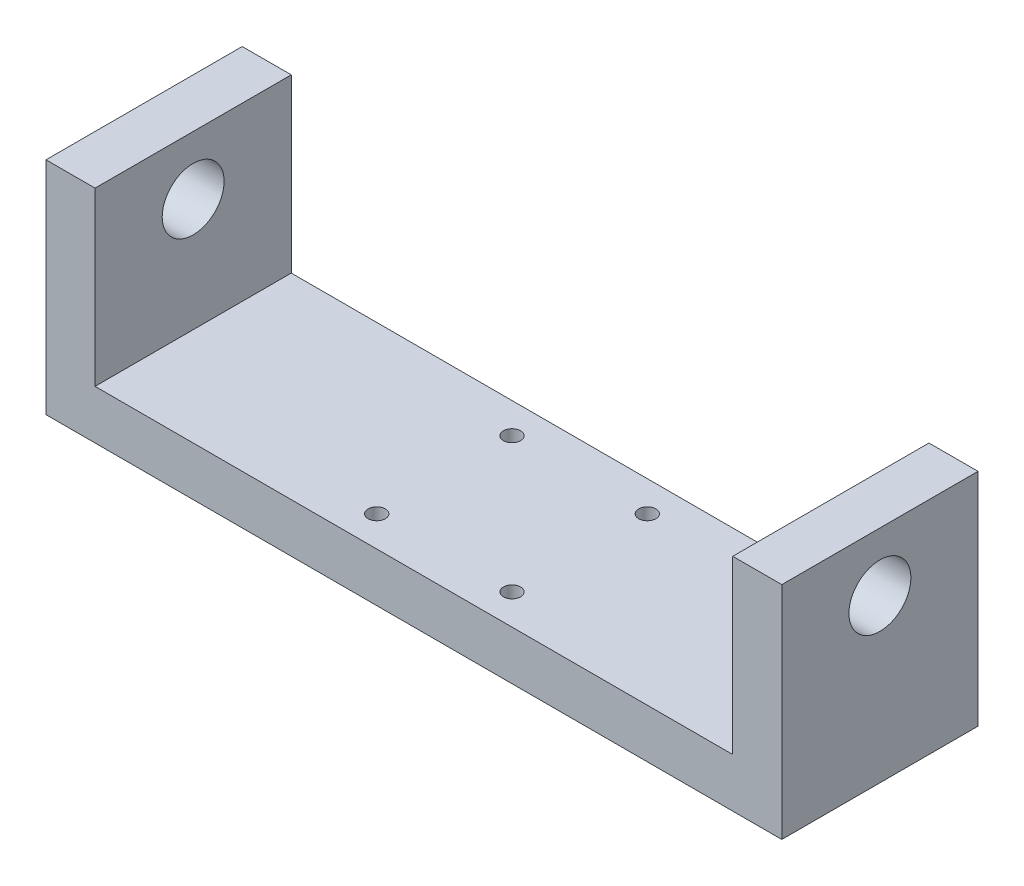
ISO-10303-21;
HEADER;
FILE_DESCRIPTION(('STEP AP214'),'2;1');
FILE_NAME('part.step','',(''),(''),'','','');
FILE_SCHEMA(('AUTOMOTIVE_DESIGN { 1 0 10303 214 1 1 1 1 }'));
ENDSEC;
DATA;
#1=APPLICATION_CONTEXT('core data for automotive mechanical design processes');
#2=APPLICATION_PROTOCOL_DEFINITION('international standard','automotive_design',2000,#1);
#3=PRODUCT_CONTEXT('',#1,'mechanical');
#4=PRODUCT('Part','Part','',(#3));
#5=PRODUCT_RELATED_PRODUCT_CATEGORY('part','',(#4));
#6=PRODUCT_DEFINITION_FORMATION('','',#4);
#7=PRODUCT_DEFINITION_CONTEXT('part definition',#1,'design');
#8=PRODUCT_DEFINITION('design','',#6,#7);
#9=PRODUCT_DEFINITION_SHAPE('','',#8);
#10=(LENGTH_UNIT() NAMED_UNIT(*) SI_UNIT(.MILLI.,.METRE.));
#11=(NAMED_UNIT(*) PLANE_ANGLE_UNIT() SI_UNIT($,.RADIAN.));
#12=(NAMED_UNIT(*) SI_UNIT($,.STERADIAN.) SOLID_ANGLE_UNIT());
#13=UNCERTAINTY_MEASURE_WITH_UNIT(LENGTH_MEASURE(1.E-05),#10,'distance_accuracy_value','');
#14=(GEOMETRIC_REPRESENTATION_CONTEXT(3) GLOBAL_UNCERTAINTY_ASSIGNED_CONTEXT((#13)) GLOBAL_UNIT_ASSIGNED_CONTEXT((#10,
#11,#12)) REPRESENTATION_CONTEXT('',''));
#15=CARTESIAN_POINT('',(0.,0.,0.));
#16=DIRECTION('',(0.,0.,1.));
#17=DIRECTION('',(1.,0.,0.));
#18=AXIS2_PLACEMENT_3D('',#15,#16,#17);
#19=CARTESIAN_POINT('',(-65.,10.,40.));
#20=DIRECTION('',(-1.,0.,0.));
#21=DIRECTION('',(0.,0.,1.));
#22=AXIS2_PLACEMENT_3D('',#19,#20,#21);
#23=PLANE('',#22);
#24=CARTESIAN_POINT('',(-65.,33.0538057999214,20.));
#25=DIRECTION('',(-1.,0.,0.));
#26=DIRECTION('',(0.,0.,1.));
#27=AXIS2_PLACEMENT_3D('',#24,#25,#26);
#28=CIRCLE('',#27,6.3126);
#29=CARTESIAN_POINT('',(-65.,33.0538057999214,26.3126));
#30=VERTEX_POINT('',#29);
#31=EDGE_CURVE('E195',#30,#30,#28,.T.);
#32=ORIENTED_EDGE('',*,*,#31,.T.);
#33=EDGE_LOOP('',(#32));
#34=FACE_BOUND('',#33,.T.);
#35=DIRECTION('',(0.,1.,0.));
#36=VECTOR('',#35,1.);
#37=CARTESIAN_POINT('',(-65.,10.,0.));
#38=LINE('',#37,#36);
#39=CARTESIAN_POINT('',(-65.,10.,0.));
#40=VERTEX_POINT('',#39);
#41=CARTESIAN_POINT('',(-65.,45.,0.));
#42=VERTEX_POINT('',#41);
#43=EDGE_CURVE('E132',#40,#42,#38,.T.);
#44=ORIENTED_EDGE('',*,*,#43,.T.);
#45=DIRECTION('',(0.,0.,-1.));
#46=VECTOR('',#45,1.);
#47=CARTESIAN_POINT('',(-65.,45.,40.));
#48=LINE('',#47,#46);
#49=CARTESIAN_POINT('',(-65.,45.,40.));
#50=VERTEX_POINT('',#49);
#51=EDGE_CURVE('E11',#50,#42,#48,.T.);
#52=ORIENTED_EDGE('',*,*,#51,.F.);
#53=DIRECTION('',(0.,1.,0.));
#54=VECTOR('',#53,1.);
#55=CARTESIAN_POINT('',(-65.,10.,40.));
#56=LINE('',#55,#54);
#57=CARTESIAN_POINT('',(-65.,10.,40.));
#58=VERTEX_POINT('',#57);
#59=EDGE_CURVE('E152',#58,#50,#56,.T.);
#60=ORIENTED_EDGE('',*,*,#59,.F.);
#61=DIRECTION('',(0.,0.,-1.));
#62=VECTOR('',#61,1.);
#63=CARTESIAN_POINT('',(-65.,10.,40.));
#64=LINE('',#63,#62);
#65=EDGE_CURVE('E52',#58,#40,#64,.T.);
#66=ORIENTED_EDGE('',*,*,#65,.T.);
#67=EDGE_LOOP('',(#44,#52,#60,#66));
#68=FACE_BOUND('',#67,.T.);
#69=ADVANCED_FACE('F35',(#34,#68),#23,.F.);
#70=CARTESIAN_POINT('',(-65.,45.,40.));
#71=DIRECTION('',(0.,-1.,0.));
#72=DIRECTION('',(1.,0.,0.));
#73=AXIS2_PLACEMENT_3D('',#70,#71,#72);
#74=PLANE('',#73);
#75=DIRECTION('',(-1.,0.,0.));
#76=VECTOR('',#75,1.);
#77=CARTESIAN_POINT('',(-65.,45.,0.));
#78=LINE('',#77,#76);
#79=CARTESIAN_POINT('',(-75.,45.,0.));
#80=VERTEX_POINT('',#79);
#81=EDGE_CURVE('E134',#42,#80,#78,.T.);
#82=ORIENTED_EDGE('',*,*,#81,.T.);
#83=DIRECTION('',(0.,0.,-1.));
#84=VECTOR('',#83,1.);
#85=CARTESIAN_POINT('',(-75.,45.,40.));
#86=LINE('',#85,#84);
#87=CARTESIAN_POINT('',(-75.,45.,40.));
#88=VERTEX_POINT('',#87);
#89=EDGE_CURVE('E44',#88,#80,#86,.T.);
#90=ORIENTED_EDGE('',*,*,#89,.F.);
#91=DIRECTION('',(-1.,0.,0.));
#92=VECTOR('',#91,1.);
#93=CARTESIAN_POINT('',(-65.,45.,40.));
#94=LINE('',#93,#92);
#95=EDGE_CURVE('E90',#50,#88,#94,.T.);
#96=ORIENTED_EDGE('',*,*,#95,.F.);
#97=ORIENTED_EDGE('',*,*,#51,.T.);
#98=EDGE_LOOP('',(#82,#90,#96,#97));
#99=FACE_BOUND('',#98,.T.);
#100=ADVANCED_FACE('F167',(#99),#74,.F.);
#101=CARTESIAN_POINT('',(-75.,0.,40.));
#102=DIRECTION('',(-1.,0.,0.));
#103=DIRECTION('',(0.,0.,1.));
#104=AXIS2_PLACEMENT_3D('',#101,#102,#103);
#105=PLANE('',#104);
#106=CARTESIAN_POINT('',(-75.,33.0538057999214,20.));
#107=DIRECTION('',(-1.,0.,0.));
#108=DIRECTION('',(0.,0.,1.));
#109=AXIS2_PLACEMENT_3D('',#106,#107,#108);
#110=CIRCLE('',#109,6.3126);
#111=CARTESIAN_POINT('',(-75.,33.0538057999214,26.3126));
#112=VERTEX_POINT('',#111);
#113=EDGE_CURVE('E211',#112,#112,#110,.T.);
#114=ORIENTED_EDGE('',*,*,#113,.F.);
#115=EDGE_LOOP('',(#114));
#116=FACE_BOUND('',#115,.T.);
#117=DIRECTION('',(0.,1.,0.));
#118=VECTOR('',#117,1.);
#119=CARTESIAN_POINT('',(-75.,0.,0.));
#120=LINE('',#119,#118);
#121=CARTESIAN_POINT('',(-75.,0.,0.));
#122=VERTEX_POINT('',#121);
#123=EDGE_CURVE('E138',#122,#80,#120,.T.);
#124=ORIENTED_EDGE('',*,*,#123,.F.);
#125=DIRECTION('',(0.,0.,-1.));
#126=VECTOR('',#125,1.);
#127=CARTESIAN_POINT('',(-75.,0.,40.));
#128=LINE('',#127,#126);
#129=CARTESIAN_POINT('',(-75.,0.,40.));
#130=VERTEX_POINT('',#129);
#131=EDGE_CURVE('E159',#130,#122,#128,.T.);
#132=ORIENTED_EDGE('',*,*,#131,.F.);
#133=DIRECTION('',(0.,1.,0.));
#134=VECTOR('',#133,1.);
#135=CARTESIAN_POINT('',(-75.,0.,40.));
#136=LINE('',#135,#134);
#137=EDGE_CURVE('E166',#130,#88,#136,.T.);
#138=ORIENTED_EDGE('',*,*,#137,.T.);
#139=ORIENTED_EDGE('',*,*,#89,.T.);
#140=EDGE_LOOP('',(#124,#132,#138,#139));
#141=FACE_BOUND('',#140,.T.);
#142=ADVANCED_FACE('F164',(#116,#141),#105,.T.);
#143=CARTESIAN_POINT('',(-75.,0.,40.));
#144=DIRECTION('',(0.,1.,0.));
#145=DIRECTION('',(-1.,0.,0.));
#146=AXIS2_PLACEMENT_3D('',#143,#144,#145);
#147=PLANE('',#146);
#148=CARTESIAN_POINT('',(-13.7885822331377,0.,33.7885822331377));
#149=DIRECTION('',(0.,1.,0.));
#150=DIRECTION('',(0.,0.,1.));
#151=AXIS2_PLACEMENT_3D('',#148,#149,#150);
#152=CIRCLE('',#151,1.75);
#153=CARTESIAN_POINT('',(-13.7885822331377,0.,35.5385822331376));
#154=VERTEX_POINT('',#153);
#155=EDGE_CURVE('E194',#154,#154,#152,.T.);
#156=ORIENTED_EDGE('',*,*,#155,.T.);
#157=EDGE_LOOP('',(#156));
#158=FACE_BOUND('',#157,.T.);
#159=CARTESIAN_POINT('',(13.7885822331377,0.,33.7885822331377));
#160=DIRECTION('',(0.,1.,0.));
#161=DIRECTION('',(0.,0.,1.));
#162=AXIS2_PLACEMENT_3D('',#159,#160,#161);
#163=CIRCLE('',#162,1.75);
#164=CARTESIAN_POINT('',(13.7885822331377,0.,35.5385822331377));
#165=VERTEX_POINT('',#164);
#166=EDGE_CURVE('E201',#165,#165,#163,.T.);
#167=ORIENTED_EDGE('',*,*,#166,.T.);
#168=EDGE_LOOP('',(#167));
#169=FACE_BOUND('',#168,.T.);
#170=CARTESIAN_POINT('',(13.7885822331377,0.,6.21141776686233));
#171=DIRECTION('',(0.,1.,0.));
#172=DIRECTION('',(0.,0.,1.));
#173=AXIS2_PLACEMENT_3D('',#170,#171,#172);
#174=CIRCLE('',#173,1.75);
#175=CARTESIAN_POINT('',(13.7885822331377,0.,7.96141776686233));
#176=VERTEX_POINT('',#175);
#177=EDGE_CURVE('E188',#176,#176,#174,.T.);
#178=ORIENTED_EDGE('',*,*,#177,.T.);
#179=EDGE_LOOP('',(#178));
#180=FACE_BOUND('',#179,.T.);
#181=CARTESIAN_POINT('',(-13.7885822331377,0.,6.21141776686229));
#182=DIRECTION('',(0.,1.,0.));
#183=DIRECTION('',(0.,0.,1.));
#184=AXIS2_PLACEMENT_3D('',#181,#182,#183);
#185=CIRCLE('',#184,1.75);
#186=CARTESIAN_POINT('',(-13.7885822331377,0.,7.96141776686229));
#187=VERTEX_POINT('',#186);
#188=EDGE_CURVE('E135',#187,#187,#185,.T.);
#189=ORIENTED_EDGE('',*,*,#188,.T.);
#190=EDGE_LOOP('',(#189));
#191=FACE_BOUND('',#190,.T.);
#192=DIRECTION('',(1.,0.,0.));
#193=VECTOR('',#192,1.);
#194=CARTESIAN_POINT('',(-75.,0.,0.));
#195=LINE('',#194,#193);
#196=CARTESIAN_POINT('',(75.,0.,0.));
#197=VERTEX_POINT('',#196);
#198=EDGE_CURVE('E141',#122,#197,#195,.T.);
#199=ORIENTED_EDGE('',*,*,#198,.T.);
#200=DIRECTION('',(0.,0.,-1.));
#201=VECTOR('',#200,1.);
#202=CARTESIAN_POINT('',(75.,0.,40.));
#203=LINE('',#202,#201);
#204=CARTESIAN_POINT('',(75.,0.,40.));
#205=VERTEX_POINT('',#204);
#206=EDGE_CURVE('E156',#205,#197,#203,.T.);
#207=ORIENTED_EDGE('',*,*,#206,.F.);
#208=DIRECTION('',(1.,0.,0.));
#209=VECTOR('',#208,1.);
#210=CARTESIAN_POINT('',(-75.,0.,40.));
#211=LINE('',#210,#209);
#212=EDGE_CURVE('E179',#130,#205,#211,.T.);
#213=ORIENTED_EDGE('',*,*,#212,.F.);
#214=ORIENTED_EDGE('',*,*,#131,.T.);
#215=EDGE_LOOP('',(#199,#207,#213,#214));
#216=FACE_BOUND('',#215,.T.);
#217=ADVANCED_FACE('F175',(#158,#169,#180,#191,#216),#147,.F.);
#218=CARTESIAN_POINT('',(75.,0.,40.));
#219=DIRECTION('',(-1.,0.,0.));
#220=DIRECTION('',(0.,-1.,0.));
#221=AXIS2_PLACEMENT_3D('',#218,#219,#220);
#222=PLANE('',#221);
#223=CARTESIAN_POINT('',(75.,33.0538057999214,20.));
#224=DIRECTION('',(-1.,0.,0.));
#225=DIRECTION('',(0.,0.,1.));
#226=AXIS2_PLACEMENT_3D('',#223,#224,#225);
#227=CIRCLE('',#226,6.3126);
#228=CARTESIAN_POINT('',(75.,33.0538057999214,26.3126));
#229=VERTEX_POINT('',#228);
#230=EDGE_CURVE('E214',#229,#229,#227,.T.);
#231=ORIENTED_EDGE('',*,*,#230,.T.);
#232=EDGE_LOOP('',(#231));
#233=FACE_BOUND('',#232,.T.);
#234=DIRECTION('',(0.,1.,0.));
#235=VECTOR('',#234,1.);
#236=CARTESIAN_POINT('',(75.,0.,0.));
#237=LINE('',#236,#235);
#238=CARTESIAN_POINT('',(75.,45.,0.));
#239=VERTEX_POINT('',#238);
#240=EDGE_CURVE('E143',#197,#239,#237,.T.);
#241=ORIENTED_EDGE('',*,*,#240,.T.);
#242=DIRECTION('',(0.,0.,-1.));
#243=VECTOR('',#242,1.);
#244=CARTESIAN_POINT('',(75.,45.,40.));
#245=LINE('',#244,#243);
#246=CARTESIAN_POINT('',(75.,45.,40.));
#247=VERTEX_POINT('',#246);
#248=EDGE_CURVE('E115',#247,#239,#245,.T.);
#249=ORIENTED_EDGE('',*,*,#248,.F.);
#250=DIRECTION('',(0.,1.,0.));
#251=VECTOR('',#250,1.);
#252=CARTESIAN_POINT('',(75.,0.,40.));
#253=LINE('',#252,#251);
#254=EDGE_CURVE('E123',#205,#247,#253,.T.);
#255=ORIENTED_EDGE('',*,*,#254,.F.);
#256=ORIENTED_EDGE('',*,*,#206,.T.);
#257=EDGE_LOOP('',(#241,#249,#255,#256));
#258=FACE_BOUND('',#257,.T.);
#259=ADVANCED_FACE('F178',(#233,#258),#222,.F.);
#260=CARTESIAN_POINT('',(65.,45.,40.));
#261=DIRECTION('',(0.,1.,0.));
#262=DIRECTION('',(-1.,0.,0.));
#263=AXIS2_PLACEMENT_3D('',#260,#261,#262);
#264=PLANE('',#263);
#265=DIRECTION('',(1.,0.,0.));
#266=VECTOR('',#265,1.);
#267=CARTESIAN_POINT('',(65.,45.,0.));
#268=LINE('',#267,#266);
#269=CARTESIAN_POINT('',(65.,45.,0.));
#270=VERTEX_POINT('',#269);
#271=EDGE_CURVE('E111',#270,#239,#268,.T.);
#272=ORIENTED_EDGE('',*,*,#271,.F.);
#273=DIRECTION('',(0.,0.,-1.));
#274=VECTOR('',#273,1.);
#275=CARTESIAN_POINT('',(65.,45.,40.));
#276=LINE('',#275,#274);
#277=CARTESIAN_POINT('',(65.,45.,40.));
#278=VERTEX_POINT('',#277);
#279=EDGE_CURVE('E106',#278,#270,#276,.T.);
#280=ORIENTED_EDGE('',*,*,#279,.F.);
#281=DIRECTION('',(1.,0.,0.));
#282=VECTOR('',#281,1.);
#283=CARTESIAN_POINT('',(65.,45.,40.));
#284=LINE('',#283,#282);
#285=EDGE_CURVE('E109',#278,#247,#284,.T.);
#286=ORIENTED_EDGE('',*,*,#285,.T.);
#287=ORIENTED_EDGE('',*,*,#248,.T.);
#288=EDGE_LOOP('',(#272,#280,#286,#287));
#289=FACE_BOUND('',#288,.T.);
#290=ADVANCED_FACE('F108',(#289),#264,.T.);
#291=CARTESIAN_POINT('',(65.,10.,40.));
#292=DIRECTION('',(-1.,0.,0.));
#293=DIRECTION('',(0.,-1.,0.));
#294=AXIS2_PLACEMENT_3D('',#291,#292,#293);
#295=PLANE('',#294);
#296=CARTESIAN_POINT('',(65.,33.0538057999214,20.));
#297=DIRECTION('',(-1.,0.,0.));
#298=DIRECTION('',(0.,-1.,0.));
#299=AXIS2_PLACEMENT_3D('',#296,#297,#298);
#300=CIRCLE('',#299,6.3126);
#301=CARTESIAN_POINT('',(65.,26.7412057999214,20.));
#302=VERTEX_POINT('',#301);
#303=EDGE_CURVE('E38',#302,#302,#300,.T.);
#304=ORIENTED_EDGE('',*,*,#303,.F.);
#305=EDGE_LOOP('',(#304));
#306=FACE_BOUND('',#305,.T.);
#307=DIRECTION('',(0.,1.,0.));
#308=VECTOR('',#307,1.);
#309=CARTESIAN_POINT('',(65.,10.,0.));
#310=LINE('',#309,#308);
#311=CARTESIAN_POINT('',(65.,10.,0.));
#312=VERTEX_POINT('',#311);
#313=EDGE_CURVE('E147',#312,#270,#310,.T.);
#314=ORIENTED_EDGE('',*,*,#313,.F.);
#315=DIRECTION('',(0.,0.,-1.));
#316=VECTOR('',#315,1.);
#317=CARTESIAN_POINT('',(65.,10.,40.));
#318=LINE('',#317,#316);
#319=CARTESIAN_POINT('',(65.,10.,40.));
#320=VERTEX_POINT('',#319);
#321=EDGE_CURVE('E78',#320,#312,#318,.T.);
#322=ORIENTED_EDGE('',*,*,#321,.F.);
#323=DIRECTION('',(0.,1.,0.));
#324=VECTOR('',#323,1.);
#325=CARTESIAN_POINT('',(65.,10.,40.));
#326=LINE('',#325,#324);
#327=EDGE_CURVE('E121',#320,#278,#326,.T.);
#328=ORIENTED_EDGE('',*,*,#327,.T.);
#329=ORIENTED_EDGE('',*,*,#279,.T.);
#330=EDGE_LOOP('',(#314,#322,#328,#329));
#331=FACE_BOUND('',#330,.T.);
#332=ADVANCED_FACE('F126',(#306,#331),#295,.T.);
#333=CARTESIAN_POINT('',(-65.,10.,40.));
#334=DIRECTION('',(0.,1.,0.));
#335=DIRECTION('',(-1.,0.,0.));
#336=AXIS2_PLACEMENT_3D('',#333,#334,#335);
#337=PLANE('',#336);
#338=CARTESIAN_POINT('',(-13.7885822331377,10.,33.7885822331377));
#339=DIRECTION('',(0.,1.,0.));
#340=DIRECTION('',(0.,0.,1.));
#341=AXIS2_PLACEMENT_3D('',#338,#339,#340);
#342=CIRCLE('',#341,1.75);
#343=CARTESIAN_POINT('',(-13.7885822331377,10.,35.5385822331376));
#344=VERTEX_POINT('',#343);
#345=EDGE_CURVE('E191',#344,#344,#342,.T.);
#346=ORIENTED_EDGE('',*,*,#345,.F.);
#347=EDGE_LOOP('',(#346));
#348=FACE_BOUND('',#347,.T.);
#349=CARTESIAN_POINT('',(13.7885822331377,10.,33.7885822331377));
#350=DIRECTION('',(0.,1.,0.));
#351=DIRECTION('',(0.,0.,1.));
#352=AXIS2_PLACEMENT_3D('',#349,#350,#351);
#353=CIRCLE('',#352,1.75);
#354=CARTESIAN_POINT('',(13.7885822331377,10.,35.5385822331377));
#355=VERTEX_POINT('',#354);
#356=EDGE_CURVE('E198',#355,#355,#353,.T.);
#357=ORIENTED_EDGE('',*,*,#356,.F.);
#358=EDGE_LOOP('',(#357));
#359=FACE_BOUND('',#358,.T.);
#360=CARTESIAN_POINT('',(13.7885822331377,10.,6.21141776686233));
#361=DIRECTION('',(0.,1.,0.));
#362=DIRECTION('',(0.,0.,1.));
#363=AXIS2_PLACEMENT_3D('',#360,#361,#362);
#364=CIRCLE('',#363,1.75);
#365=CARTESIAN_POINT('',(13.7885822331377,10.,7.96141776686233));
#366=VERTEX_POINT('',#365);
#367=EDGE_CURVE('E204',#366,#366,#364,.T.);
#368=ORIENTED_EDGE('',*,*,#367,.F.);
#369=EDGE_LOOP('',(#368));
#370=FACE_BOUND('',#369,.T.);
#371=CARTESIAN_POINT('',(-13.7885822331377,10.,6.21141776686229));
#372=DIRECTION('',(0.,1.,0.));
#373=DIRECTION('',(0.,0.,1.));
#374=AXIS2_PLACEMENT_3D('',#371,#372,#373);
#375=CIRCLE('',#374,1.75);
#376=CARTESIAN_POINT('',(-13.7885822331377,10.,7.96141776686229));
#377=VERTEX_POINT('',#376);
#378=EDGE_CURVE('E185',#377,#377,#375,.T.);
#379=ORIENTED_EDGE('',*,*,#378,.F.);
#380=EDGE_LOOP('',(#379));
#381=FACE_BOUND('',#380,.T.);
#382=DIRECTION('',(1.,0.,0.));
#383=VECTOR('',#382,1.);
#384=CARTESIAN_POINT('',(-65.,10.,0.));
#385=LINE('',#384,#383);
#386=EDGE_CURVE('E149',#40,#312,#385,.T.);
#387=ORIENTED_EDGE('',*,*,#386,.F.);
#388=ORIENTED_EDGE('',*,*,#65,.F.);
#389=DIRECTION('',(1.,0.,0.));
#390=VECTOR('',#389,1.);
#391=CARTESIAN_POINT('',(-65.,10.,40.));
#392=LINE('',#391,#390);
#393=EDGE_CURVE('E127',#58,#320,#392,.T.);
#394=ORIENTED_EDGE('',*,*,#393,.T.);
#395=ORIENTED_EDGE('',*,*,#321,.T.);
#396=EDGE_LOOP('',(#387,#388,#394,#395));
#397=FACE_BOUND('',#396,.T.);
#398=ADVANCED_FACE('F225',(#348,#359,#370,#381,#397),#337,.T.);
#399=CARTESIAN_POINT('',(0.,0.,40.));
#400=DIRECTION('',(0.,0.,1.));
#401=DIRECTION('',(1.,0.,0.));
#402=AXIS2_PLACEMENT_3D('',#399,#400,#401);
#403=PLANE('',#402);
#404=ORIENTED_EDGE('',*,*,#59,.T.);
#405=ORIENTED_EDGE('',*,*,#95,.T.);
#406=ORIENTED_EDGE('',*,*,#137,.F.);
#407=ORIENTED_EDGE('',*,*,#212,.T.);
#408=ORIENTED_EDGE('',*,*,#254,.T.);
#409=ORIENTED_EDGE('',*,*,#285,.F.);
#410=ORIENTED_EDGE('',*,*,#327,.F.);
#411=ORIENTED_EDGE('',*,*,#393,.F.);
#412=EDGE_LOOP('',(#404,#405,#406,#407,#408,#409,#410,#411));
#413=FACE_BOUND('',#412,.T.);
#414=ADVANCED_FACE('F119',(#413),#403,.T.);
#415=CARTESIAN_POINT('',(0.,0.,0.));
#416=DIRECTION('',(0.,0.,1.));
#417=DIRECTION('',(1.,0.,0.));
#418=AXIS2_PLACEMENT_3D('',#415,#416,#417);
#419=PLANE('',#418);
#420=ORIENTED_EDGE('',*,*,#43,.F.);
#421=ORIENTED_EDGE('',*,*,#386,.T.);
#422=ORIENTED_EDGE('',*,*,#313,.T.);
#423=ORIENTED_EDGE('',*,*,#271,.T.);
#424=ORIENTED_EDGE('',*,*,#240,.F.);
#425=ORIENTED_EDGE('',*,*,#198,.F.);
#426=ORIENTED_EDGE('',*,*,#123,.T.);
#427=ORIENTED_EDGE('',*,*,#81,.F.);
#428=EDGE_LOOP('',(#420,#421,#422,#423,#424,#425,#426,#427));
#429=FACE_BOUND('',#428,.T.);
#430=ADVANCED_FACE('F171',(#429),#419,.F.);
#431=CARTESIAN_POINT('',(-13.7885822331377,0.,6.21141776686229));
#432=DIRECTION('',(0.,1.,0.));
#433=DIRECTION('',(0.,0.,1.));
#434=AXIS2_PLACEMENT_3D('',#431,#432,#433);
#435=CYLINDRICAL_SURFACE('',#434,1.75);
#436=ORIENTED_EDGE('',*,*,#188,.F.);
#437=EDGE_LOOP('',(#436));
#438=FACE_BOUND('',#437,.T.);
#439=ORIENTED_EDGE('',*,*,#378,.T.);
#440=EDGE_LOOP('',(#439));
#441=FACE_BOUND('',#440,.T.);
#442=ADVANCED_FACE('F254',(#438,#441),#435,.F.);
#443=CARTESIAN_POINT('',(13.7885822331377,0.,6.21141776686233));
#444=DIRECTION('',(0.,1.,0.));
#445=DIRECTION('',(0.,0.,1.));
#446=AXIS2_PLACEMENT_3D('',#443,#444,#445);
#447=CYLINDRICAL_SURFACE('',#446,1.75);
#448=ORIENTED_EDGE('',*,*,#177,.F.);
#449=EDGE_LOOP('',(#448));
#450=FACE_BOUND('',#449,.T.);
#451=ORIENTED_EDGE('',*,*,#367,.T.);
#452=EDGE_LOOP('',(#451));
#453=FACE_BOUND('',#452,.T.);
#454=ADVANCED_FACE('F250',(#450,#453),#447,.F.);
#455=CARTESIAN_POINT('',(13.7885822331377,0.,33.7885822331377));
#456=DIRECTION('',(0.,1.,0.));
#457=DIRECTION('',(0.,0.,1.));
#458=AXIS2_PLACEMENT_3D('',#455,#456,#457);
#459=CYLINDRICAL_SURFACE('',#458,1.75);
#460=ORIENTED_EDGE('',*,*,#166,.F.);
#461=EDGE_LOOP('',(#460));
#462=FACE_BOUND('',#461,.T.);
#463=ORIENTED_EDGE('',*,*,#356,.T.);
#464=EDGE_LOOP('',(#463));
#465=FACE_BOUND('',#464,.T.);
#466=ADVANCED_FACE('F253',(#462,#465),#459,.F.);
#467=CARTESIAN_POINT('',(-13.7885822331377,0.,33.7885822331377));
#468=DIRECTION('',(0.,1.,0.));
#469=DIRECTION('',(0.,0.,1.));
#470=AXIS2_PLACEMENT_3D('',#467,#468,#469);
#471=CYLINDRICAL_SURFACE('',#470,1.75);
#472=ORIENTED_EDGE('',*,*,#155,.F.);
#473=EDGE_LOOP('',(#472));
#474=FACE_BOUND('',#473,.T.);
#475=ORIENTED_EDGE('',*,*,#345,.T.);
#476=EDGE_LOOP('',(#475));
#477=FACE_BOUND('',#476,.T.);
#478=ADVANCED_FACE('F248',(#474,#477),#471,.F.);
#479=CARTESIAN_POINT('',(75.,33.0538057999214,20.));
#480=DIRECTION('',(-1.,0.,0.));
#481=DIRECTION('',(0.,0.,1.));
#482=AXIS2_PLACEMENT_3D('',#479,#480,#481);
#483=CYLINDRICAL_SURFACE('',#482,6.3126);
#484=ORIENTED_EDGE('',*,*,#303,.T.);
#485=EDGE_LOOP('',(#484));
#486=FACE_BOUND('',#485,.T.);
#487=ORIENTED_EDGE('',*,*,#230,.F.);
#488=EDGE_LOOP('',(#487));
#489=FACE_BOUND('',#488,.T.);
#490=ADVANCED_FACE('F221',(#486,#489),#483,.F.);
#491=ORIENTED_EDGE('',*,*,#113,.T.);
#492=EDGE_LOOP('',(#491));
#493=FACE_BOUND('',#492,.T.);
#494=ORIENTED_EDGE('',*,*,#31,.F.);
#495=EDGE_LOOP('',(#494));
#496=FACE_BOUND('',#495,.T.);
#497=ADVANCED_FACE('F241',(#493,#496),#483,.F.);
#498=CLOSED_SHELL('',(#69,#100,#142,#217,#259,#290,#332,#398,#414,#430,#442,#454,#466,#478,#490,#497));
#499=MANIFOLD_SOLID_BREP('B2',#498);
#500=ADVANCED_BREP_SHAPE_REPRESENTATION('',(#18,#499),#14);
#501=SHAPE_DEFINITION_REPRESENTATION(#9,#500);
ENDSEC;
END-ISO-10303-21;
